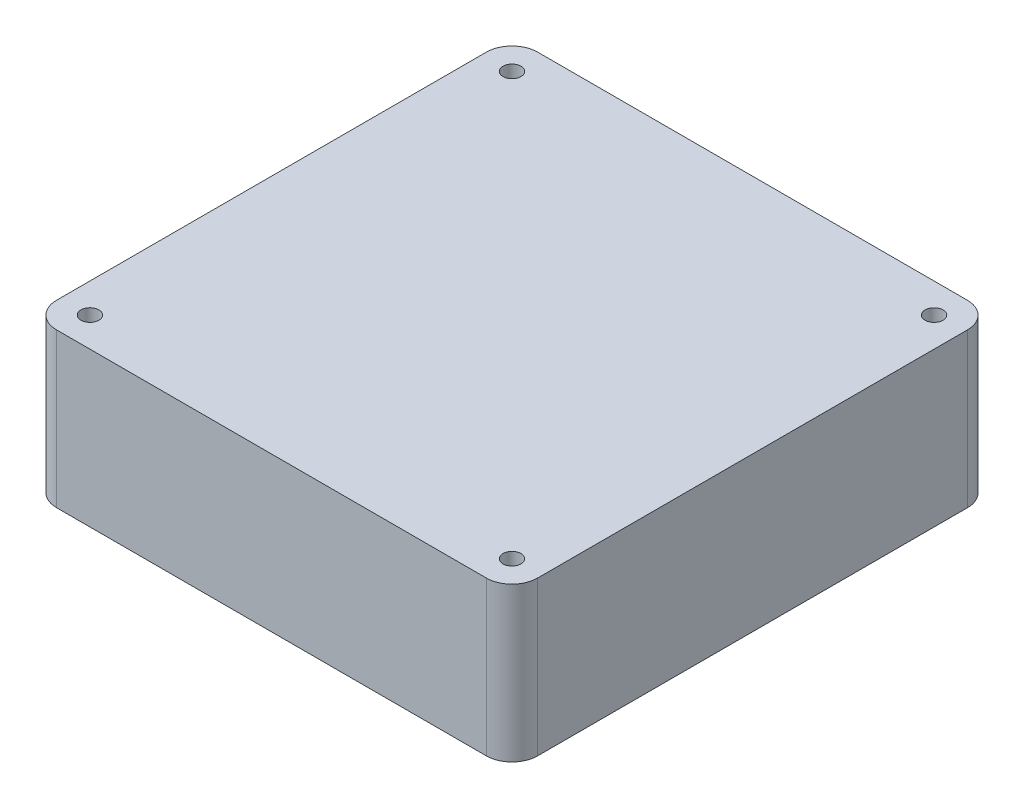
ISO-10303-21;
HEADER;
FILE_DESCRIPTION(('STEP AP214'),'2;1');
FILE_NAME('part.step','',(''),(''),'','','');
FILE_SCHEMA(('AUTOMOTIVE_DESIGN { 1 0 10303 214 1 1 1 1 }'));
ENDSEC;
DATA;
#1=APPLICATION_CONTEXT('core data for automotive mechanical design processes');
#2=APPLICATION_PROTOCOL_DEFINITION('international standard','automotive_design',2000,#1);
#3=PRODUCT_CONTEXT('',#1,'mechanical');
#4=PRODUCT('Part','Part','',(#3));
#5=PRODUCT_RELATED_PRODUCT_CATEGORY('part','',(#4));
#6=PRODUCT_DEFINITION_FORMATION('','',#4);
#7=PRODUCT_DEFINITION_CONTEXT('part definition',#1,'design');
#8=PRODUCT_DEFINITION('design','',#6,#7);
#9=PRODUCT_DEFINITION_SHAPE('','',#8);
#10=(LENGTH_UNIT() NAMED_UNIT(*) SI_UNIT(.MILLI.,.METRE.));
#11=(NAMED_UNIT(*) PLANE_ANGLE_UNIT() SI_UNIT($,.RADIAN.));
#12=(NAMED_UNIT(*) SI_UNIT($,.STERADIAN.) SOLID_ANGLE_UNIT());
#13=UNCERTAINTY_MEASURE_WITH_UNIT(LENGTH_MEASURE(1.E-05),#10,'distance_accuracy_value','');
#14=(GEOMETRIC_REPRESENTATION_CONTEXT(3) GLOBAL_UNCERTAINTY_ASSIGNED_CONTEXT((#13)) GLOBAL_UNIT_ASSIGNED_CONTEXT((#10,
#11,#12)) REPRESENTATION_CONTEXT('',''));
#15=CARTESIAN_POINT('',(0.,0.,0.));
#16=DIRECTION('',(0.,0.,1.));
#17=DIRECTION('',(1.,0.,0.));
#18=AXIS2_PLACEMENT_3D('',#15,#16,#17);
#19=CARTESIAN_POINT('',(-53.152675752502,38.1,53.1463240577313));
#20=DIRECTION('',(0.,-1.,0.));
#21=DIRECTION('',(0.,0.,-1.));
#22=AXIS2_PLACEMENT_3D('',#19,#20,#21);
#23=PLANE('',#22);
#24=CARTESIAN_POINT('',(52.1938809742594,38.1,52.2001188393747));
#25=DIRECTION('',(0.,1.,0.));
#26=DIRECTION('',(0.,0.,1.));
#27=AXIS2_PLACEMENT_3D('',#24,#25,#26);
#28=CIRCLE('',#27,2.2225);
#29=CARTESIAN_POINT('',(52.1938809742594,38.1,49.9776188393747));
#30=VERTEX_POINT('',#29);
#31=EDGE_CURVE('E188',#30,#30,#28,.T.);
#32=ORIENTED_EDGE('',*,*,#31,.F.);
#33=EDGE_LOOP('',(#32));
#34=FACE_BOUND('',#33,.T.);
#35=CARTESIAN_POINT('',(-52.1938809742594,38.1,-52.2001188393747));
#36=DIRECTION('',(0.,1.,0.));
#37=DIRECTION('',(0.,0.,1.));
#38=AXIS2_PLACEMENT_3D('',#35,#36,#37);
#39=CIRCLE('',#38,2.2225);
#40=CARTESIAN_POINT('',(-52.1938809742594,38.1,-54.4226188393747));
#41=VERTEX_POINT('',#40);
#42=EDGE_CURVE('E134',#41,#41,#39,.T.);
#43=ORIENTED_EDGE('',*,*,#42,.F.);
#44=EDGE_LOOP('',(#43));
#45=FACE_BOUND('',#44,.T.);
#46=CARTESIAN_POINT('',(-53.152675752502,38.1,53.1463240577313));
#47=DIRECTION('',(0.,1.,0.));
#48=DIRECTION('',(0.,0.,-1.));
#49=AXIS2_PLACEMENT_3D('',#46,#47,#48);
#50=CIRCLE('',#49,6.35);
#51=CARTESIAN_POINT('',(-59.5026757411659,38.1,53.1459446255466));
#52=VERTEX_POINT('',#51);
#53=CARTESIAN_POINT('',(-53.1530551846866,38.1,59.4963240463952));
#54=VERTEX_POINT('',#53);
#55=EDGE_CURVE('E145',#52,#54,#50,.T.);
#56=ORIENTED_EDGE('',*,*,#55,.T.);
#57=DIRECTION('',(0.999999998214784,0.,5.97530999416178E-05));
#58=VECTOR('',#57,1.);
#59=CARTESIAN_POINT('',(53.1459446255466,38.1,59.5026757411659));
#60=LINE('',#59,#58);
#61=CARTESIAN_POINT('',(53.1459446255466,38.1,59.5026757411659));
#62=VERTEX_POINT('',#61);
#63=EDGE_CURVE('E93',#54,#62,#60,.T.);
#64=ORIENTED_EDGE('',*,*,#63,.T.);
#65=CARTESIAN_POINT('',(53.1463240577313,38.1,53.152675752502));
#66=DIRECTION('',(0.,1.,0.));
#67=DIRECTION('',(0.,0.,1.));
#68=AXIS2_PLACEMENT_3D('',#65,#66,#67);
#69=CIRCLE('',#68,6.35);
#70=CARTESIAN_POINT('',(59.4963240463952,38.1,53.1530551846866));
#71=VERTEX_POINT('',#70);
#72=EDGE_CURVE('E160',#62,#71,#69,.T.);
#73=ORIENTED_EDGE('',*,*,#72,.T.);
#74=DIRECTION('',(5.97530999418136E-05,0.,-0.999999998214784));
#75=VECTOR('',#74,1.);
#76=CARTESIAN_POINT('',(59.4963240463952,38.1,53.1530551846866));
#77=LINE('',#76,#75);
#78=CARTESIAN_POINT('',(59.5026757411659,38.1,-53.1459446255466));
#79=VERTEX_POINT('',#78);
#80=EDGE_CURVE('E173',#71,#79,#77,.T.);
#81=ORIENTED_EDGE('',*,*,#80,.T.);
#82=CARTESIAN_POINT('',(53.152675752502,38.1,-53.1463240577313));
#83=DIRECTION('',(0.,1.,0.));
#84=DIRECTION('',(0.,0.,1.));
#85=AXIS2_PLACEMENT_3D('',#82,#83,#84);
#86=CIRCLE('',#85,6.35);
#87=CARTESIAN_POINT('',(53.1530551846866,38.1,-59.4963240463952));
#88=VERTEX_POINT('',#87);
#89=EDGE_CURVE('E112',#79,#88,#86,.T.);
#90=ORIENTED_EDGE('',*,*,#89,.T.);
#91=DIRECTION('',(-0.999999998214784,0.,-5.97530999416178E-05));
#92=VECTOR('',#91,1.);
#93=CARTESIAN_POINT('',(53.1530551846866,38.1,-59.4963240463952));
#94=LINE('',#93,#92);
#95=CARTESIAN_POINT('',(-53.1459446255466,38.1,-59.5026757411659));
#96=VERTEX_POINT('',#95);
#97=EDGE_CURVE('E106',#88,#96,#94,.T.);
#98=ORIENTED_EDGE('',*,*,#97,.T.);
#99=CARTESIAN_POINT('',(-53.1463240577313,38.1,-53.152675752502));
#100=DIRECTION('',(0.,1.,0.));
#101=DIRECTION('',(0.,0.,1.));
#102=AXIS2_PLACEMENT_3D('',#99,#100,#101);
#103=CIRCLE('',#102,6.35);
#104=CARTESIAN_POINT('',(-59.4963240463951,38.1,-53.1530551846866));
#105=VERTEX_POINT('',#104);
#106=EDGE_CURVE('E110',#96,#105,#103,.T.);
#107=ORIENTED_EDGE('',*,*,#106,.T.);
#108=DIRECTION('',(-5.97530999418136E-05,0.,0.999999998214784));
#109=VECTOR('',#108,1.);
#110=CARTESIAN_POINT('',(-59.5026757411659,38.1,53.1459446255466));
#111=LINE('',#110,#109);
#112=EDGE_CURVE('E50',#105,#52,#111,.T.);
#113=ORIENTED_EDGE('',*,*,#112,.T.);
#114=EDGE_LOOP('',(#56,#64,#73,#81,#90,#98,#107,#113));
#115=FACE_BOUND('',#114,.T.);
#116=CARTESIAN_POINT('',(52.2001188393747,38.1,-52.1938809742594));
#117=DIRECTION('',(0.,1.,0.));
#118=DIRECTION('',(0.,0.,1.));
#119=AXIS2_PLACEMENT_3D('',#116,#117,#118);
#120=CIRCLE('',#119,2.2225);
#121=CARTESIAN_POINT('',(52.2001188393747,38.1,-54.4163809742594));
#122=VERTEX_POINT('',#121);
#123=EDGE_CURVE('E182',#122,#122,#120,.T.);
#124=ORIENTED_EDGE('',*,*,#123,.F.);
#125=EDGE_LOOP('',(#124));
#126=FACE_BOUND('',#125,.T.);
#127=CARTESIAN_POINT('',(-52.2001188393747,38.1,52.1938809742594));
#128=DIRECTION('',(0.,1.,0.));
#129=DIRECTION('',(0.,0.,1.));
#130=AXIS2_PLACEMENT_3D('',#127,#128,#129);
#131=CIRCLE('',#130,2.2225);
#132=CARTESIAN_POINT('',(-52.2001188393747,38.1,49.9713809742594));
#133=VERTEX_POINT('',#132);
#134=EDGE_CURVE('E194',#133,#133,#131,.T.);
#135=ORIENTED_EDGE('',*,*,#134,.F.);
#136=EDGE_LOOP('',(#135));
#137=FACE_BOUND('',#136,.T.);
#138=ADVANCED_FACE('F33',(#34,#45,#115,#126,#137),#23,.F.);
#139=CARTESIAN_POINT('',(-53.152675752502,0.,53.1463240577313));
#140=DIRECTION('',(0.,-1.,0.));
#141=DIRECTION('',(0.,0.,-1.));
#142=AXIS2_PLACEMENT_3D('',#139,#140,#141);
#143=PLANE('',#142);
#144=CARTESIAN_POINT('',(52.1938809742594,0.,52.2001188393747));
#145=DIRECTION('',(0.,1.,0.));
#146=DIRECTION('',(0.,0.,1.));
#147=AXIS2_PLACEMENT_3D('',#144,#145,#146);
#148=CIRCLE('',#147,2.2225);
#149=CARTESIAN_POINT('',(52.1938809742594,0.,49.9776188393747));
#150=VERTEX_POINT('',#149);
#151=EDGE_CURVE('E191',#150,#150,#148,.T.);
#152=ORIENTED_EDGE('',*,*,#151,.T.);
#153=EDGE_LOOP('',(#152));
#154=FACE_BOUND('',#153,.T.);
#155=CARTESIAN_POINT('',(-52.1938809742594,0.,-52.2001188393747));
#156=DIRECTION('',(0.,1.,0.));
#157=DIRECTION('',(0.,0.,1.));
#158=AXIS2_PLACEMENT_3D('',#155,#156,#157);
#159=CIRCLE('',#158,2.2225);
#160=CARTESIAN_POINT('',(-52.1938809742594,0.,-54.4226188393747));
#161=VERTEX_POINT('',#160);
#162=EDGE_CURVE('E179',#161,#161,#159,.T.);
#163=ORIENTED_EDGE('',*,*,#162,.T.);
#164=EDGE_LOOP('',(#163));
#165=FACE_BOUND('',#164,.T.);
#166=CARTESIAN_POINT('',(-53.152675752502,0.,53.1463240577313));
#167=DIRECTION('',(0.,1.,0.));
#168=DIRECTION('',(0.,0.,-1.));
#169=AXIS2_PLACEMENT_3D('',#166,#167,#168);
#170=CIRCLE('',#169,6.35);
#171=CARTESIAN_POINT('',(-59.5026757411659,0.,53.1459446255466));
#172=VERTEX_POINT('',#171);
#173=CARTESIAN_POINT('',(-53.1530551846866,0.,59.4963240463952));
#174=VERTEX_POINT('',#173);
#175=EDGE_CURVE('E130',#172,#174,#170,.T.);
#176=ORIENTED_EDGE('',*,*,#175,.F.);
#177=DIRECTION('',(-5.97530999418136E-05,0.,0.999999998214784));
#178=VECTOR('',#177,1.);
#179=CARTESIAN_POINT('',(-59.5026757411659,0.,53.1459446255466));
#180=LINE('',#179,#178);
#181=CARTESIAN_POINT('',(-59.4963240463951,0.,-53.1530551846866));
#182=VERTEX_POINT('',#181);
#183=EDGE_CURVE('E85',#182,#172,#180,.T.);
#184=ORIENTED_EDGE('',*,*,#183,.F.);
#185=CARTESIAN_POINT('',(-53.1463240577313,0.,-53.152675752502));
#186=DIRECTION('',(0.,1.,0.));
#187=DIRECTION('',(0.,0.,1.));
#188=AXIS2_PLACEMENT_3D('',#185,#186,#187);
#189=CIRCLE('',#188,6.35);
#190=CARTESIAN_POINT('',(-53.1459446255466,0.,-59.5026757411659));
#191=VERTEX_POINT('',#190);
#192=EDGE_CURVE('E79',#191,#182,#189,.T.);
#193=ORIENTED_EDGE('',*,*,#192,.F.);
#194=DIRECTION('',(-0.999999998214784,0.,-5.97530999416178E-05));
#195=VECTOR('',#194,1.);
#196=CARTESIAN_POINT('',(53.1530551846866,0.,-59.4963240463952));
#197=LINE('',#196,#195);
#198=CARTESIAN_POINT('',(53.1530551846866,0.,-59.4963240463952));
#199=VERTEX_POINT('',#198);
#200=EDGE_CURVE('E120',#199,#191,#197,.T.);
#201=ORIENTED_EDGE('',*,*,#200,.F.);
#202=CARTESIAN_POINT('',(53.152675752502,0.,-53.1463240577313));
#203=DIRECTION('',(0.,1.,0.));
#204=DIRECTION('',(0.,0.,1.));
#205=AXIS2_PLACEMENT_3D('',#202,#203,#204);
#206=CIRCLE('',#205,6.35);
#207=CARTESIAN_POINT('',(59.5026757411659,0.,-53.1459446255466));
#208=VERTEX_POINT('',#207);
#209=EDGE_CURVE('E140',#208,#199,#206,.T.);
#210=ORIENTED_EDGE('',*,*,#209,.F.);
#211=DIRECTION('',(5.97530999418136E-05,0.,-0.999999998214784));
#212=VECTOR('',#211,1.);
#213=CARTESIAN_POINT('',(59.4963240463952,0.,53.1530551846866));
#214=LINE('',#213,#212);
#215=CARTESIAN_POINT('',(59.4963240463952,0.,53.1530551846866));
#216=VERTEX_POINT('',#215);
#217=EDGE_CURVE('E138',#216,#208,#214,.T.);
#218=ORIENTED_EDGE('',*,*,#217,.F.);
#219=CARTESIAN_POINT('',(53.1463240577313,0.,53.152675752502));
#220=DIRECTION('',(0.,1.,0.));
#221=DIRECTION('',(0.,0.,1.));
#222=AXIS2_PLACEMENT_3D('',#219,#220,#221);
#223=CIRCLE('',#222,6.35);
#224=CARTESIAN_POINT('',(53.1459446255466,0.,59.5026757411659));
#225=VERTEX_POINT('',#224);
#226=EDGE_CURVE('E136',#225,#216,#223,.T.);
#227=ORIENTED_EDGE('',*,*,#226,.F.);
#228=DIRECTION('',(0.999999998214784,0.,5.97530999416178E-05));
#229=VECTOR('',#228,1.);
#230=CARTESIAN_POINT('',(53.1459446255466,0.,59.5026757411659));
#231=LINE('',#230,#229);
#232=EDGE_CURVE('E133',#174,#225,#231,.T.);
#233=ORIENTED_EDGE('',*,*,#232,.F.);
#234=EDGE_LOOP('',(#176,#184,#193,#201,#210,#218,#227,#233));
#235=FACE_BOUND('',#234,.T.);
#236=CARTESIAN_POINT('',(52.2001188393747,0.,-52.1938809742594));
#237=DIRECTION('',(0.,1.,0.));
#238=DIRECTION('',(0.,0.,1.));
#239=AXIS2_PLACEMENT_3D('',#236,#237,#238);
#240=CIRCLE('',#239,2.2225);
#241=CARTESIAN_POINT('',(52.2001188393747,0.,-54.4163809742594));
#242=VERTEX_POINT('',#241);
#243=EDGE_CURVE('E185',#242,#242,#240,.T.);
#244=ORIENTED_EDGE('',*,*,#243,.T.);
#245=EDGE_LOOP('',(#244));
#246=FACE_BOUND('',#245,.T.);
#247=CARTESIAN_POINT('',(-52.2001188393747,0.,52.1938809742594));
#248=DIRECTION('',(0.,1.,0.));
#249=DIRECTION('',(0.,0.,1.));
#250=AXIS2_PLACEMENT_3D('',#247,#248,#249);
#251=CIRCLE('',#250,2.2225);
#252=CARTESIAN_POINT('',(-52.2001188393747,0.,49.9713809742594));
#253=VERTEX_POINT('',#252);
#254=EDGE_CURVE('E197',#253,#253,#251,.T.);
#255=ORIENTED_EDGE('',*,*,#254,.T.);
#256=EDGE_LOOP('',(#255));
#257=FACE_BOUND('',#256,.T.);
#258=ADVANCED_FACE('F164',(#154,#165,#235,#246,#257),#143,.T.);
#259=CARTESIAN_POINT('',(-53.152675752502,38.1,53.1463240577313));
#260=DIRECTION('',(0.,-1.,0.));
#261=DIRECTION('',(0.,0.,-1.));
#262=AXIS2_PLACEMENT_3D('',#259,#260,#261);
#263=CYLINDRICAL_SURFACE('',#262,6.35);
#264=ORIENTED_EDGE('',*,*,#175,.T.);
#265=DIRECTION('',(0.,-1.,0.));
#266=VECTOR('',#265,1.);
#267=CARTESIAN_POINT('',(-53.1530551846866,38.1,59.4963240463952));
#268=LINE('',#267,#266);
#269=EDGE_CURVE('E11',#54,#174,#268,.T.);
#270=ORIENTED_EDGE('',*,*,#269,.F.);
#271=ORIENTED_EDGE('',*,*,#55,.F.);
#272=DIRECTION('',(0.,-1.,0.));
#273=VECTOR('',#272,1.);
#274=CARTESIAN_POINT('',(-59.5026757411659,38.1,53.1459446255466));
#275=LINE('',#274,#273);
#276=EDGE_CURVE('E126',#52,#172,#275,.T.);
#277=ORIENTED_EDGE('',*,*,#276,.T.);
#278=EDGE_LOOP('',(#264,#270,#271,#277));
#279=FACE_BOUND('',#278,.T.);
#280=ADVANCED_FACE('F35',(#279),#263,.T.);
#281=CARTESIAN_POINT('',(53.1459446255466,38.1,59.5026757411659));
#282=DIRECTION('',(5.97530999416178E-05,0.,-0.999999998214783));
#283=DIRECTION('',(-0.999999998214784,0.,-5.97530999416178E-05));
#284=AXIS2_PLACEMENT_3D('',#281,#282,#283);
#285=PLANE('',#284);
#286=ORIENTED_EDGE('',*,*,#232,.T.);
#287=DIRECTION('',(0.,-1.,0.));
#288=VECTOR('',#287,1.);
#289=CARTESIAN_POINT('',(53.1459446255466,38.1,59.5026757411659));
#290=LINE('',#289,#288);
#291=EDGE_CURVE('E42',#62,#225,#290,.T.);
#292=ORIENTED_EDGE('',*,*,#291,.F.);
#293=ORIENTED_EDGE('',*,*,#63,.F.);
#294=ORIENTED_EDGE('',*,*,#269,.T.);
#295=EDGE_LOOP('',(#286,#292,#293,#294));
#296=FACE_BOUND('',#295,.T.);
#297=ADVANCED_FACE('F232',(#296),#285,.F.);
#298=CARTESIAN_POINT('',(53.1463240577313,38.1,53.152675752502));
#299=DIRECTION('',(0.,-1.,0.));
#300=DIRECTION('',(0.,0.,-1.));
#301=AXIS2_PLACEMENT_3D('',#298,#299,#300);
#302=CYLINDRICAL_SURFACE('',#301,6.35);
#303=ORIENTED_EDGE('',*,*,#226,.T.);
#304=DIRECTION('',(0.,-1.,0.));
#305=VECTOR('',#304,1.);
#306=CARTESIAN_POINT('',(59.4963240463952,38.1,53.1530551846866));
#307=LINE('',#306,#305);
#308=EDGE_CURVE('E152',#71,#216,#307,.T.);
#309=ORIENTED_EDGE('',*,*,#308,.F.);
#310=ORIENTED_EDGE('',*,*,#72,.F.);
#311=ORIENTED_EDGE('',*,*,#291,.T.);
#312=EDGE_LOOP('',(#303,#309,#310,#311));
#313=FACE_BOUND('',#312,.T.);
#314=ADVANCED_FACE('F158',(#313),#302,.T.);
#315=CARTESIAN_POINT('',(59.4963240463952,38.1,53.1530551846866));
#316=DIRECTION('',(-0.999999998214783,0.,-5.97530999418136E-05));
#317=DIRECTION('',(-5.97530999418136E-05,0.,0.999999998214784));
#318=AXIS2_PLACEMENT_3D('',#315,#316,#317);
#319=PLANE('',#318);
#320=ORIENTED_EDGE('',*,*,#217,.T.);
#321=DIRECTION('',(0.,-1.,0.));
#322=VECTOR('',#321,1.);
#323=CARTESIAN_POINT('',(59.5026757411659,38.1,-53.1459446255466));
#324=LINE('',#323,#322);
#325=EDGE_CURVE('E149',#79,#208,#324,.T.);
#326=ORIENTED_EDGE('',*,*,#325,.F.);
#327=ORIENTED_EDGE('',*,*,#80,.F.);
#328=ORIENTED_EDGE('',*,*,#308,.T.);
#329=EDGE_LOOP('',(#320,#326,#327,#328));
#330=FACE_BOUND('',#329,.T.);
#331=ADVANCED_FACE('F169',(#330),#319,.F.);
#332=CARTESIAN_POINT('',(53.152675752502,38.1,-53.1463240577313));
#333=DIRECTION('',(0.,-1.,0.));
#334=DIRECTION('',(0.,0.,-1.));
#335=AXIS2_PLACEMENT_3D('',#332,#333,#334);
#336=CYLINDRICAL_SURFACE('',#335,6.35);
#337=ORIENTED_EDGE('',*,*,#209,.T.);
#338=DIRECTION('',(0.,-1.,0.));
#339=VECTOR('',#338,1.);
#340=CARTESIAN_POINT('',(53.1530551846866,38.1,-59.4963240463952));
#341=LINE('',#340,#339);
#342=EDGE_CURVE('E121',#88,#199,#341,.T.);
#343=ORIENTED_EDGE('',*,*,#342,.F.);
#344=ORIENTED_EDGE('',*,*,#89,.F.);
#345=ORIENTED_EDGE('',*,*,#325,.T.);
#346=EDGE_LOOP('',(#337,#343,#344,#345));
#347=FACE_BOUND('',#346,.T.);
#348=ADVANCED_FACE('F172',(#347),#336,.T.);
#349=CARTESIAN_POINT('',(53.1530551846866,38.1,-59.4963240463952));
#350=DIRECTION('',(-5.97530999416178E-05,0.,0.999999998214783));
#351=DIRECTION('',(0.999999998214784,0.,5.97530999416178E-05));
#352=AXIS2_PLACEMENT_3D('',#349,#350,#351);
#353=PLANE('',#352);
#354=ORIENTED_EDGE('',*,*,#200,.T.);
#355=DIRECTION('',(0.,-1.,0.));
#356=VECTOR('',#355,1.);
#357=CARTESIAN_POINT('',(-53.1459446255466,38.1,-59.5026757411659));
#358=LINE('',#357,#356);
#359=EDGE_CURVE('E117',#96,#191,#358,.T.);
#360=ORIENTED_EDGE('',*,*,#359,.F.);
#361=ORIENTED_EDGE('',*,*,#97,.F.);
#362=ORIENTED_EDGE('',*,*,#342,.T.);
#363=EDGE_LOOP('',(#354,#360,#361,#362));
#364=FACE_BOUND('',#363,.T.);
#365=ADVANCED_FACE('F118',(#364),#353,.F.);
#366=CARTESIAN_POINT('',(-53.1463240577313,38.1,-53.152675752502));
#367=DIRECTION('',(0.,-1.,0.));
#368=DIRECTION('',(0.,0.,-1.));
#369=AXIS2_PLACEMENT_3D('',#366,#367,#368);
#370=CYLINDRICAL_SURFACE('',#369,6.35);
#371=ORIENTED_EDGE('',*,*,#192,.T.);
#372=DIRECTION('',(0.,-1.,0.));
#373=VECTOR('',#372,1.);
#374=CARTESIAN_POINT('',(-59.4963240463951,38.1,-53.1530551846866));
#375=LINE('',#374,#373);
#376=EDGE_CURVE('E122',#105,#182,#375,.T.);
#377=ORIENTED_EDGE('',*,*,#376,.F.);
#378=ORIENTED_EDGE('',*,*,#106,.F.);
#379=ORIENTED_EDGE('',*,*,#359,.T.);
#380=EDGE_LOOP('',(#371,#377,#378,#379));
#381=FACE_BOUND('',#380,.T.);
#382=ADVANCED_FACE('F124',(#381),#370,.T.);
#383=CARTESIAN_POINT('',(-59.5026757411659,38.1,53.1459446255466));
#384=DIRECTION('',(0.999999998214783,0.,5.97530999418136E-05));
#385=DIRECTION('',(5.97530999418136E-05,0.,-0.999999998214784));
#386=AXIS2_PLACEMENT_3D('',#383,#384,#385);
#387=PLANE('',#386);
#388=ORIENTED_EDGE('',*,*,#183,.T.);
#389=ORIENTED_EDGE('',*,*,#276,.F.);
#390=ORIENTED_EDGE('',*,*,#112,.F.);
#391=ORIENTED_EDGE('',*,*,#376,.T.);
#392=EDGE_LOOP('',(#388,#389,#390,#391));
#393=FACE_BOUND('',#392,.T.);
#394=ADVANCED_FACE('F220',(#393),#387,.F.);
#395=CARTESIAN_POINT('',(-52.1938809742594,38.1,-52.2001188393747));
#396=DIRECTION('',(0.,-1.,0.));
#397=DIRECTION('',(0.,0.,-1.));
#398=AXIS2_PLACEMENT_3D('',#395,#396,#397);
#399=CYLINDRICAL_SURFACE('',#398,2.2225);
#400=CARTESIAN_POINT('',(-52.1938809742594,38.1,-54.4226188393747));
#401=CARTESIAN_POINT('',(-52.1938809742594,37.703125,-54.4226188393747));
#402=CARTESIAN_POINT('',(-52.1938809742594,37.30625,-54.4226188393747));
#403=CARTESIAN_POINT('',(-52.1938809742594,36.5125,-54.4226188393747));
#404=CARTESIAN_POINT('',(-52.1938809742594,36.115625,-54.4226188393747));
#405=CARTESIAN_POINT('',(-52.1938809742594,35.321875,-54.4226188393747));
#406=CARTESIAN_POINT('',(-52.1938809742594,34.925,-54.4226188393747));
#407=CARTESIAN_POINT('',(-52.1938809742594,34.13125,-54.4226188393747));
#408=CARTESIAN_POINT('',(-52.1938809742594,33.734375,-54.4226188393747));
#409=CARTESIAN_POINT('',(-52.1938809742594,32.940625,-54.4226188393747));
#410=CARTESIAN_POINT('',(-52.1938809742594,32.54375,-54.4226188393747));
#411=CARTESIAN_POINT('',(-52.1938809742594,31.75,-54.4226188393747));
#412=CARTESIAN_POINT('',(-52.1938809742594,31.353125,-54.4226188393747));
#413=CARTESIAN_POINT('',(-52.1938809742594,30.559375,-54.4226188393747));
#414=CARTESIAN_POINT('',(-52.1938809742594,30.1625,-54.4226188393747));
#415=CARTESIAN_POINT('',(-52.1938809742594,29.36875,-54.4226188393747));
#416=CARTESIAN_POINT('',(-52.1938809742594,28.971875,-54.4226188393747));
#417=CARTESIAN_POINT('',(-52.1938809742594,28.178125,-54.4226188393747));
#418=CARTESIAN_POINT('',(-52.1938809742594,27.78125,-54.4226188393747));
#419=CARTESIAN_POINT('',(-52.1938809742594,26.9875,-54.4226188393747));
#420=CARTESIAN_POINT('',(-52.1938809742594,26.590625,-54.4226188393747));
#421=CARTESIAN_POINT('',(-52.1938809742594,25.796875,-54.4226188393747));
#422=CARTESIAN_POINT('',(-52.1938809742594,25.4,-54.4226188393747));
#423=CARTESIAN_POINT('',(-52.1938809742594,24.60625,-54.4226188393747));
#424=CARTESIAN_POINT('',(-52.1938809742594,24.209375,-54.4226188393747));
#425=CARTESIAN_POINT('',(-52.1938809742594,23.415625,-54.4226188393747));
#426=CARTESIAN_POINT('',(-52.1938809742594,23.01875,-54.4226188393747));
#427=CARTESIAN_POINT('',(-52.1938809742594,22.225,-54.4226188393747));
#428=CARTESIAN_POINT('',(-52.1938809742594,21.828125,-54.4226188393747));
#429=CARTESIAN_POINT('',(-52.1938809742594,21.034375,-54.4226188393747));
#430=CARTESIAN_POINT('',(-52.1938809742594,20.6375,-54.4226188393747));
#431=CARTESIAN_POINT('',(-52.1938809742594,19.84375,-54.4226188393747));
#432=CARTESIAN_POINT('',(-52.1938809742594,19.446875,-54.4226188393747));
#433=CARTESIAN_POINT('',(-52.1938809742594,18.653125,-54.4226188393747));
#434=CARTESIAN_POINT('',(-52.1938809742594,18.25625,-54.4226188393747));
#435=CARTESIAN_POINT('',(-52.1938809742594,17.4625,-54.4226188393747));
#436=CARTESIAN_POINT('',(-52.1938809742594,17.065625,-54.4226188393747));
#437=CARTESIAN_POINT('',(-52.1938809742594,16.271875,-54.4226188393747));
#438=CARTESIAN_POINT('',(-52.1938809742594,15.875,-54.4226188393747));
#439=CARTESIAN_POINT('',(-52.1938809742594,15.08125,-54.4226188393747));
#440=CARTESIAN_POINT('',(-52.1938809742594,14.684375,-54.4226188393747));
#441=CARTESIAN_POINT('',(-52.1938809742594,13.890625,-54.4226188393747));
#442=CARTESIAN_POINT('',(-52.1938809742594,13.49375,-54.4226188393747));
#443=CARTESIAN_POINT('',(-52.1938809742594,12.7,-54.4226188393747));
#444=CARTESIAN_POINT('',(-52.1938809742594,12.303125,-54.4226188393747));
#445=CARTESIAN_POINT('',(-52.1938809742594,11.509375,-54.4226188393747));
#446=CARTESIAN_POINT('',(-52.1938809742594,11.1125,-54.4226188393747));
#447=CARTESIAN_POINT('',(-52.1938809742594,10.31875,-54.4226188393747));
#448=CARTESIAN_POINT('',(-52.1938809742594,9.92187499999999,-54.4226188393747));
#449=CARTESIAN_POINT('',(-52.1938809742594,9.128125,-54.4226188393747));
#450=CARTESIAN_POINT('',(-52.1938809742594,8.73124999999999,-54.4226188393747));
#451=CARTESIAN_POINT('',(-52.1938809742594,7.93749999999999,-54.4226188393747));
#452=CARTESIAN_POINT('',(-52.1938809742594,7.54062499999999,-54.4226188393747));
#453=CARTESIAN_POINT('',(-52.1938809742594,6.746875,-54.4226188393747));
#454=CARTESIAN_POINT('',(-52.1938809742594,6.35,-54.4226188393747));
#455=CARTESIAN_POINT('',(-52.1938809742594,5.55625,-54.4226188393747));
#456=CARTESIAN_POINT('',(-52.1938809742594,5.159375,-54.4226188393747));
#457=CARTESIAN_POINT('',(-52.1938809742594,4.365625,-54.4226188393747));
#458=CARTESIAN_POINT('',(-52.1938809742594,3.96875,-54.4226188393747));
#459=CARTESIAN_POINT('',(-52.1938809742594,3.175,-54.4226188393747));
#460=CARTESIAN_POINT('',(-52.1938809742594,2.778125,-54.4226188393747));
#461=CARTESIAN_POINT('',(-52.1938809742594,1.984375,-54.4226188393747));
#462=CARTESIAN_POINT('',(-52.1938809742594,1.5875,-54.4226188393747));
#463=CARTESIAN_POINT('',(-52.1938809742594,0.79375,-54.4226188393747));
#464=CARTESIAN_POINT('',(-52.1938809742594,0.396875,-54.4226188393747));
#465=CARTESIAN_POINT('',(-52.1938809742594,0.,-54.4226188393747));
#466=B_SPLINE_CURVE_WITH_KNOTS('',3,(#400,#401,#402,#403,#404,#405,#406,#407,#408,#409,#410,
#411,#412,#413,#414,#415,#416,#417,#418,#419,#420,#421,#422,#423,#424,#425,#426,#427,#428,#429,
#430,#431,#432,#433,#434,#435,#436,#437,#438,#439,#440,#441,#442,#443,#444,#445,#446,#447,#448,
#449,#450,#451,#452,#453,#454,#455,#456,#457,#458,#459,#460,#461,#462,#463,#464,#465),
.UNSPECIFIED.,.F.,.F.,(4,2,2,2,2,2,2,2,2,2,2,2,2,2,2,2,2,2,2,2,2,2,2,2,2,2,2,2,2,2,2,2,4),(0.,
1.190625,2.38125,3.571875,4.7625,5.953125,7.14375,8.334375,9.52500000000001,10.715625,11.90625,
13.096875,14.2875,15.478125,16.66875,17.859375,19.05,20.240625,21.43125,22.621875,23.8125,
25.003125,26.19375,27.384375,28.575,29.765625,30.95625,32.146875,33.3375,34.528125,35.71875,
36.909375,38.1),.UNSPECIFIED.);
#467=EDGE_CURVE('BSEAM217',#41,#161,#466,.T.);
#468=ORIENTED_EDGE('',*,*,#42,.T.);
#469=ORIENTED_EDGE('',*,*,#162,.F.);
#470=ORIENTED_EDGE('',*,*,#467,.T.);
#471=ORIENTED_EDGE('',*,*,#467,.F.);
#472=EDGE_LOOP('',(#468,#470,#469,#471));
#473=FACE_BOUND('',#472,.T.);
#474=ADVANCED_FACE('F217',(#473),#399,.F.);
#475=CARTESIAN_POINT('',(52.2001188393747,38.1,-52.1938809742594));
#476=DIRECTION('',(0.,-1.,0.));
#477=DIRECTION('',(0.,0.,-1.));
#478=AXIS2_PLACEMENT_3D('',#475,#476,#477);
#479=CYLINDRICAL_SURFACE('',#478,2.2225);
#480=CARTESIAN_POINT('',(52.2001188393747,38.1,-54.4163809742594));
#481=CARTESIAN_POINT('',(52.2001188393747,37.703125,-54.4163809742594));
#482=CARTESIAN_POINT('',(52.2001188393747,37.30625,-54.4163809742594));
#483=CARTESIAN_POINT('',(52.2001188393747,36.5125,-54.4163809742594));
#484=CARTESIAN_POINT('',(52.2001188393747,36.115625,-54.4163809742594));
#485=CARTESIAN_POINT('',(52.2001188393747,35.321875,-54.4163809742594));
#486=CARTESIAN_POINT('',(52.2001188393747,34.925,-54.4163809742594));
#487=CARTESIAN_POINT('',(52.2001188393747,34.13125,-54.4163809742594));
#488=CARTESIAN_POINT('',(52.2001188393747,33.734375,-54.4163809742594));
#489=CARTESIAN_POINT('',(52.2001188393747,32.940625,-54.4163809742594));
#490=CARTESIAN_POINT('',(52.2001188393747,32.54375,-54.4163809742594));
#491=CARTESIAN_POINT('',(52.2001188393747,31.75,-54.4163809742594));
#492=CARTESIAN_POINT('',(52.2001188393747,31.353125,-54.4163809742594));
#493=CARTESIAN_POINT('',(52.2001188393747,30.559375,-54.4163809742594));
#494=CARTESIAN_POINT('',(52.2001188393747,30.1625,-54.4163809742594));
#495=CARTESIAN_POINT('',(52.2001188393747,29.36875,-54.4163809742594));
#496=CARTESIAN_POINT('',(52.2001188393747,28.971875,-54.4163809742594));
#497=CARTESIAN_POINT('',(52.2001188393747,28.178125,-54.4163809742594));
#498=CARTESIAN_POINT('',(52.2001188393747,27.78125,-54.4163809742594));
#499=CARTESIAN_POINT('',(52.2001188393747,26.9875,-54.4163809742594));
#500=CARTESIAN_POINT('',(52.2001188393747,26.590625,-54.4163809742594));
#501=CARTESIAN_POINT('',(52.2001188393747,25.796875,-54.4163809742594));
#502=CARTESIAN_POINT('',(52.2001188393747,25.4,-54.4163809742594));
#503=CARTESIAN_POINT('',(52.2001188393747,24.60625,-54.4163809742594));
#504=CARTESIAN_POINT('',(52.2001188393747,24.209375,-54.4163809742594));
#505=CARTESIAN_POINT('',(52.2001188393747,23.415625,-54.4163809742594));
#506=CARTESIAN_POINT('',(52.2001188393747,23.01875,-54.4163809742594));
#507=CARTESIAN_POINT('',(52.2001188393747,22.225,-54.4163809742594));
#508=CARTESIAN_POINT('',(52.2001188393747,21.828125,-54.4163809742594));
#509=CARTESIAN_POINT('',(52.2001188393747,21.034375,-54.4163809742594));
#510=CARTESIAN_POINT('',(52.2001188393747,20.6375,-54.4163809742594));
#511=CARTESIAN_POINT('',(52.2001188393747,19.84375,-54.4163809742594));
#512=CARTESIAN_POINT('',(52.2001188393747,19.446875,-54.4163809742594));
#513=CARTESIAN_POINT('',(52.2001188393747,18.653125,-54.4163809742594));
#514=CARTESIAN_POINT('',(52.2001188393747,18.25625,-54.4163809742594));
#515=CARTESIAN_POINT('',(52.2001188393747,17.4625,-54.4163809742594));
#516=CARTESIAN_POINT('',(52.2001188393747,17.065625,-54.4163809742594));
#517=CARTESIAN_POINT('',(52.2001188393747,16.271875,-54.4163809742594));
#518=CARTESIAN_POINT('',(52.2001188393747,15.875,-54.4163809742594));
#519=CARTESIAN_POINT('',(52.2001188393747,15.08125,-54.4163809742594));
#520=CARTESIAN_POINT('',(52.2001188393747,14.684375,-54.4163809742594));
#521=CARTESIAN_POINT('',(52.2001188393747,13.890625,-54.4163809742594));
#522=CARTESIAN_POINT('',(52.2001188393747,13.49375,-54.4163809742594));
#523=CARTESIAN_POINT('',(52.2001188393747,12.7,-54.4163809742594));
#524=CARTESIAN_POINT('',(52.2001188393747,12.303125,-54.4163809742594));
#525=CARTESIAN_POINT('',(52.2001188393747,11.509375,-54.4163809742594));
#526=CARTESIAN_POINT('',(52.2001188393747,11.1125,-54.4163809742594));
#527=CARTESIAN_POINT('',(52.2001188393747,10.31875,-54.4163809742594));
#528=CARTESIAN_POINT('',(52.2001188393747,9.92187499999999,-54.4163809742594));
#529=CARTESIAN_POINT('',(52.2001188393747,9.128125,-54.4163809742594));
#530=CARTESIAN_POINT('',(52.2001188393747,8.73124999999999,-54.4163809742594));
#531=CARTESIAN_POINT('',(52.2001188393747,7.93749999999999,-54.4163809742594));
#532=CARTESIAN_POINT('',(52.2001188393747,7.54062499999999,-54.4163809742594));
#533=CARTESIAN_POINT('',(52.2001188393747,6.746875,-54.4163809742594));
#534=CARTESIAN_POINT('',(52.2001188393747,6.35,-54.4163809742594));
#535=CARTESIAN_POINT('',(52.2001188393747,5.55625,-54.4163809742594));
#536=CARTESIAN_POINT('',(52.2001188393747,5.159375,-54.4163809742594));
#537=CARTESIAN_POINT('',(52.2001188393747,4.365625,-54.4163809742594));
#538=CARTESIAN_POINT('',(52.2001188393747,3.96875,-54.4163809742594));
#539=CARTESIAN_POINT('',(52.2001188393747,3.175,-54.4163809742594));
#540=CARTESIAN_POINT('',(52.2001188393747,2.778125,-54.4163809742594));
#541=CARTESIAN_POINT('',(52.2001188393747,1.984375,-54.4163809742594));
#542=CARTESIAN_POINT('',(52.2001188393747,1.5875,-54.4163809742594));
#543=CARTESIAN_POINT('',(52.2001188393747,0.79375,-54.4163809742594));
#544=CARTESIAN_POINT('',(52.2001188393747,0.396875,-54.4163809742594));
#545=CARTESIAN_POINT('',(52.2001188393747,0.,-54.4163809742594));
#546=B_SPLINE_CURVE_WITH_KNOTS('',3,(#480,#481,#482,#483,#484,#485,#486,#487,#488,#489,#490,
#491,#492,#493,#494,#495,#496,#497,#498,#499,#500,#501,#502,#503,#504,#505,#506,#507,#508,#509,
#510,#511,#512,#513,#514,#515,#516,#517,#518,#519,#520,#521,#522,#523,#524,#525,#526,#527,#528,
#529,#530,#531,#532,#533,#534,#535,#536,#537,#538,#539,#540,#541,#542,#543,#544,#545),
.UNSPECIFIED.,.F.,.F.,(4,2,2,2,2,2,2,2,2,2,2,2,2,2,2,2,2,2,2,2,2,2,2,2,2,2,2,2,2,2,2,2,4),(0.,
1.190625,2.38125,3.571875,4.7625,5.953125,7.14375,8.334375,9.52500000000001,10.715625,11.90625,
13.096875,14.2875,15.478125,16.66875,17.859375,19.05,20.240625,21.43125,22.621875,23.8125,
25.003125,26.19375,27.384375,28.575,29.765625,30.95625,32.146875,33.3375,34.528125,35.71875,
36.909375,38.1),.UNSPECIFIED.);
#547=EDGE_CURVE('BSEAM296',#122,#242,#546,.T.);
#548=ORIENTED_EDGE('',*,*,#123,.T.);
#549=ORIENTED_EDGE('',*,*,#243,.F.);
#550=ORIENTED_EDGE('',*,*,#547,.T.);
#551=ORIENTED_EDGE('',*,*,#547,.F.);
#552=EDGE_LOOP('',(#548,#550,#549,#551));
#553=FACE_BOUND('',#552,.T.);
#554=ADVANCED_FACE('F296',(#553),#479,.F.);
#555=CARTESIAN_POINT('',(52.1938809742594,38.1,52.2001188393747));
#556=DIRECTION('',(0.,-1.,0.));
#557=DIRECTION('',(0.,0.,-1.));
#558=AXIS2_PLACEMENT_3D('',#555,#556,#557);
#559=CYLINDRICAL_SURFACE('',#558,2.2225);
#560=CARTESIAN_POINT('',(52.1938809742594,38.1,49.9776188393747));
#561=CARTESIAN_POINT('',(52.1938809742594,37.703125,49.9776188393747));
#562=CARTESIAN_POINT('',(52.1938809742594,37.30625,49.9776188393747));
#563=CARTESIAN_POINT('',(52.1938809742594,36.5125,49.9776188393747));
#564=CARTESIAN_POINT('',(52.1938809742594,36.115625,49.9776188393747));
#565=CARTESIAN_POINT('',(52.1938809742594,35.321875,49.9776188393747));
#566=CARTESIAN_POINT('',(52.1938809742594,34.925,49.9776188393747));
#567=CARTESIAN_POINT('',(52.1938809742594,34.13125,49.9776188393747));
#568=CARTESIAN_POINT('',(52.1938809742594,33.734375,49.9776188393747));
#569=CARTESIAN_POINT('',(52.1938809742594,32.940625,49.9776188393747));
#570=CARTESIAN_POINT('',(52.1938809742594,32.54375,49.9776188393747));
#571=CARTESIAN_POINT('',(52.1938809742594,31.75,49.9776188393747));
#572=CARTESIAN_POINT('',(52.1938809742594,31.353125,49.9776188393747));
#573=CARTESIAN_POINT('',(52.1938809742594,30.559375,49.9776188393747));
#574=CARTESIAN_POINT('',(52.1938809742594,30.1625,49.9776188393747));
#575=CARTESIAN_POINT('',(52.1938809742594,29.36875,49.9776188393747));
#576=CARTESIAN_POINT('',(52.1938809742594,28.971875,49.9776188393747));
#577=CARTESIAN_POINT('',(52.1938809742594,28.178125,49.9776188393747));
#578=CARTESIAN_POINT('',(52.1938809742594,27.78125,49.9776188393747));
#579=CARTESIAN_POINT('',(52.1938809742594,26.9875,49.9776188393747));
#580=CARTESIAN_POINT('',(52.1938809742594,26.590625,49.9776188393747));
#581=CARTESIAN_POINT('',(52.1938809742594,25.796875,49.9776188393747));
#582=CARTESIAN_POINT('',(52.1938809742594,25.4,49.9776188393747));
#583=CARTESIAN_POINT('',(52.1938809742594,24.60625,49.9776188393747));
#584=CARTESIAN_POINT('',(52.1938809742594,24.209375,49.9776188393747));
#585=CARTESIAN_POINT('',(52.1938809742594,23.415625,49.9776188393747));
#586=CARTESIAN_POINT('',(52.1938809742594,23.01875,49.9776188393747));
#587=CARTESIAN_POINT('',(52.1938809742594,22.225,49.9776188393747));
#588=CARTESIAN_POINT('',(52.1938809742594,21.828125,49.9776188393747));
#589=CARTESIAN_POINT('',(52.1938809742594,21.034375,49.9776188393747));
#590=CARTESIAN_POINT('',(52.1938809742594,20.6375,49.9776188393747));
#591=CARTESIAN_POINT('',(52.1938809742594,19.84375,49.9776188393747));
#592=CARTESIAN_POINT('',(52.1938809742594,19.446875,49.9776188393747));
#593=CARTESIAN_POINT('',(52.1938809742594,18.653125,49.9776188393747));
#594=CARTESIAN_POINT('',(52.1938809742594,18.25625,49.9776188393747));
#595=CARTESIAN_POINT('',(52.1938809742594,17.4625,49.9776188393747));
#596=CARTESIAN_POINT('',(52.1938809742594,17.065625,49.9776188393747));
#597=CARTESIAN_POINT('',(52.1938809742594,16.271875,49.9776188393747));
#598=CARTESIAN_POINT('',(52.1938809742594,15.875,49.9776188393747));
#599=CARTESIAN_POINT('',(52.1938809742594,15.08125,49.9776188393747));
#600=CARTESIAN_POINT('',(52.1938809742594,14.684375,49.9776188393747));
#601=CARTESIAN_POINT('',(52.1938809742594,13.890625,49.9776188393747));
#602=CARTESIAN_POINT('',(52.1938809742594,13.49375,49.9776188393747));
#603=CARTESIAN_POINT('',(52.1938809742594,12.7,49.9776188393747));
#604=CARTESIAN_POINT('',(52.1938809742594,12.303125,49.9776188393747));
#605=CARTESIAN_POINT('',(52.1938809742594,11.509375,49.9776188393747));
#606=CARTESIAN_POINT('',(52.1938809742594,11.1125,49.9776188393747));
#607=CARTESIAN_POINT('',(52.1938809742594,10.31875,49.9776188393747));
#608=CARTESIAN_POINT('',(52.1938809742594,9.92187499999999,49.9776188393747));
#609=CARTESIAN_POINT('',(52.1938809742594,9.128125,49.9776188393747));
#610=CARTESIAN_POINT('',(52.1938809742594,8.73124999999999,49.9776188393747));
#611=CARTESIAN_POINT('',(52.1938809742594,7.93749999999999,49.9776188393747));
#612=CARTESIAN_POINT('',(52.1938809742594,7.54062499999999,49.9776188393747));
#613=CARTESIAN_POINT('',(52.1938809742594,6.746875,49.9776188393747));
#614=CARTESIAN_POINT('',(52.1938809742594,6.35,49.9776188393747));
#615=CARTESIAN_POINT('',(52.1938809742594,5.55625,49.9776188393747));
#616=CARTESIAN_POINT('',(52.1938809742594,5.159375,49.9776188393747));
#617=CARTESIAN_POINT('',(52.1938809742594,4.365625,49.9776188393747));
#618=CARTESIAN_POINT('',(52.1938809742594,3.96875,49.9776188393747));
#619=CARTESIAN_POINT('',(52.1938809742594,3.175,49.9776188393747));
#620=CARTESIAN_POINT('',(52.1938809742594,2.778125,49.9776188393747));
#621=CARTESIAN_POINT('',(52.1938809742594,1.984375,49.9776188393747));
#622=CARTESIAN_POINT('',(52.1938809742594,1.5875,49.9776188393747));
#623=CARTESIAN_POINT('',(52.1938809742594,0.79375,49.9776188393747));
#624=CARTESIAN_POINT('',(52.1938809742594,0.396875,49.9776188393747));
#625=CARTESIAN_POINT('',(52.1938809742594,0.,49.9776188393747));
#626=B_SPLINE_CURVE_WITH_KNOTS('',3,(#560,#561,#562,#563,#564,#565,#566,#567,#568,#569,#570,
#571,#572,#573,#574,#575,#576,#577,#578,#579,#580,#581,#582,#583,#584,#585,#586,#587,#588,#589,
#590,#591,#592,#593,#594,#595,#596,#597,#598,#599,#600,#601,#602,#603,#604,#605,#606,#607,#608,
#609,#610,#611,#612,#613,#614,#615,#616,#617,#618,#619,#620,#621,#622,#623,#624,#625),
.UNSPECIFIED.,.F.,.F.,(4,2,2,2,2,2,2,2,2,2,2,2,2,2,2,2,2,2,2,2,2,2,2,2,2,2,2,2,2,2,2,2,4),(0.,
1.190625,2.38125,3.571875,4.7625,5.953125,7.14375,8.334375,9.52500000000001,10.715625,11.90625,
13.096875,14.2875,15.478125,16.66875,17.859375,19.05,20.240625,21.43125,22.621875,23.8125,
25.003125,26.19375,27.384375,28.575,29.765625,30.95625,32.146875,33.3375,34.528125,35.71875,
36.909375,38.1),.UNSPECIFIED.);
#627=EDGE_CURVE('BSEAM304',#30,#150,#626,.T.);
#628=ORIENTED_EDGE('',*,*,#31,.T.);
#629=ORIENTED_EDGE('',*,*,#151,.F.);
#630=ORIENTED_EDGE('',*,*,#627,.T.);
#631=ORIENTED_EDGE('',*,*,#627,.F.);
#632=EDGE_LOOP('',(#628,#630,#629,#631));
#633=FACE_BOUND('',#632,.T.);
#634=ADVANCED_FACE('F304',(#633),#559,.F.);
#635=CARTESIAN_POINT('',(-52.2001188393747,38.1,52.1938809742594));
#636=DIRECTION('',(0.,-1.,0.));
#637=DIRECTION('',(0.,0.,-1.));
#638=AXIS2_PLACEMENT_3D('',#635,#636,#637);
#639=CYLINDRICAL_SURFACE('',#638,2.2225);
#640=CARTESIAN_POINT('',(-52.2001188393747,38.1,49.9713809742594));
#641=CARTESIAN_POINT('',(-52.2001188393747,37.703125,49.9713809742594));
#642=CARTESIAN_POINT('',(-52.2001188393747,37.30625,49.9713809742594));
#643=CARTESIAN_POINT('',(-52.2001188393747,36.5125,49.9713809742594));
#644=CARTESIAN_POINT('',(-52.2001188393747,36.115625,49.9713809742594));
#645=CARTESIAN_POINT('',(-52.2001188393747,35.321875,49.9713809742594));
#646=CARTESIAN_POINT('',(-52.2001188393747,34.925,49.9713809742594));
#647=CARTESIAN_POINT('',(-52.2001188393747,34.13125,49.9713809742594));
#648=CARTESIAN_POINT('',(-52.2001188393747,33.734375,49.9713809742594));
#649=CARTESIAN_POINT('',(-52.2001188393747,32.940625,49.9713809742594));
#650=CARTESIAN_POINT('',(-52.2001188393747,32.54375,49.9713809742594));
#651=CARTESIAN_POINT('',(-52.2001188393747,31.75,49.9713809742594));
#652=CARTESIAN_POINT('',(-52.2001188393747,31.353125,49.9713809742594));
#653=CARTESIAN_POINT('',(-52.2001188393747,30.559375,49.9713809742594));
#654=CARTESIAN_POINT('',(-52.2001188393747,30.1625,49.9713809742594));
#655=CARTESIAN_POINT('',(-52.2001188393747,29.36875,49.9713809742594));
#656=CARTESIAN_POINT('',(-52.2001188393747,28.971875,49.9713809742594));
#657=CARTESIAN_POINT('',(-52.2001188393747,28.178125,49.9713809742594));
#658=CARTESIAN_POINT('',(-52.2001188393747,27.78125,49.9713809742594));
#659=CARTESIAN_POINT('',(-52.2001188393747,26.9875,49.9713809742594));
#660=CARTESIAN_POINT('',(-52.2001188393747,26.590625,49.9713809742594));
#661=CARTESIAN_POINT('',(-52.2001188393747,25.796875,49.9713809742594));
#662=CARTESIAN_POINT('',(-52.2001188393747,25.4,49.9713809742594));
#663=CARTESIAN_POINT('',(-52.2001188393747,24.60625,49.9713809742594));
#664=CARTESIAN_POINT('',(-52.2001188393747,24.209375,49.9713809742594));
#665=CARTESIAN_POINT('',(-52.2001188393747,23.415625,49.9713809742594));
#666=CARTESIAN_POINT('',(-52.2001188393747,23.01875,49.9713809742594));
#667=CARTESIAN_POINT('',(-52.2001188393747,22.225,49.9713809742594));
#668=CARTESIAN_POINT('',(-52.2001188393747,21.828125,49.9713809742594));
#669=CARTESIAN_POINT('',(-52.2001188393747,21.034375,49.9713809742594));
#670=CARTESIAN_POINT('',(-52.2001188393747,20.6375,49.9713809742594));
#671=CARTESIAN_POINT('',(-52.2001188393747,19.84375,49.9713809742594));
#672=CARTESIAN_POINT('',(-52.2001188393747,19.446875,49.9713809742594));
#673=CARTESIAN_POINT('',(-52.2001188393747,18.653125,49.9713809742594));
#674=CARTESIAN_POINT('',(-52.2001188393747,18.25625,49.9713809742594));
#675=CARTESIAN_POINT('',(-52.2001188393747,17.4625,49.9713809742594));
#676=CARTESIAN_POINT('',(-52.2001188393747,17.065625,49.9713809742594));
#677=CARTESIAN_POINT('',(-52.2001188393747,16.271875,49.9713809742594));
#678=CARTESIAN_POINT('',(-52.2001188393747,15.875,49.9713809742594));
#679=CARTESIAN_POINT('',(-52.2001188393747,15.08125,49.9713809742594));
#680=CARTESIAN_POINT('',(-52.2001188393747,14.684375,49.9713809742594));
#681=CARTESIAN_POINT('',(-52.2001188393747,13.890625,49.9713809742594));
#682=CARTESIAN_POINT('',(-52.2001188393747,13.49375,49.9713809742594));
#683=CARTESIAN_POINT('',(-52.2001188393747,12.7,49.9713809742594));
#684=CARTESIAN_POINT('',(-52.2001188393747,12.303125,49.9713809742594));
#685=CARTESIAN_POINT('',(-52.2001188393747,11.509375,49.9713809742594));
#686=CARTESIAN_POINT('',(-52.2001188393747,11.1125,49.9713809742594));
#687=CARTESIAN_POINT('',(-52.2001188393747,10.31875,49.9713809742594));
#688=CARTESIAN_POINT('',(-52.2001188393747,9.92187499999999,49.9713809742594));
#689=CARTESIAN_POINT('',(-52.2001188393747,9.128125,49.9713809742594));
#690=CARTESIAN_POINT('',(-52.2001188393747,8.73124999999999,49.9713809742594));
#691=CARTESIAN_POINT('',(-52.2001188393747,7.93749999999999,49.9713809742594));
#692=CARTESIAN_POINT('',(-52.2001188393747,7.54062499999999,49.9713809742594));
#693=CARTESIAN_POINT('',(-52.2001188393747,6.746875,49.9713809742594));
#694=CARTESIAN_POINT('',(-52.2001188393747,6.35,49.9713809742594));
#695=CARTESIAN_POINT('',(-52.2001188393747,5.55625,49.9713809742594));
#696=CARTESIAN_POINT('',(-52.2001188393747,5.159375,49.9713809742594));
#697=CARTESIAN_POINT('',(-52.2001188393747,4.365625,49.9713809742594));
#698=CARTESIAN_POINT('',(-52.2001188393747,3.96875,49.9713809742594));
#699=CARTESIAN_POINT('',(-52.2001188393747,3.175,49.9713809742594));
#700=CARTESIAN_POINT('',(-52.2001188393747,2.778125,49.9713809742594));
#701=CARTESIAN_POINT('',(-52.2001188393747,1.984375,49.9713809742594));
#702=CARTESIAN_POINT('',(-52.2001188393747,1.5875,49.9713809742594));
#703=CARTESIAN_POINT('',(-52.2001188393747,0.79375,49.9713809742594));
#704=CARTESIAN_POINT('',(-52.2001188393747,0.396875,49.9713809742594));
#705=CARTESIAN_POINT('',(-52.2001188393747,0.,49.9713809742594));
#706=B_SPLINE_CURVE_WITH_KNOTS('',3,(#640,#641,#642,#643,#644,#645,#646,#647,#648,#649,#650,
#651,#652,#653,#654,#655,#656,#657,#658,#659,#660,#661,#662,#663,#664,#665,#666,#667,#668,#669,
#670,#671,#672,#673,#674,#675,#676,#677,#678,#679,#680,#681,#682,#683,#684,#685,#686,#687,#688,
#689,#690,#691,#692,#693,#694,#695,#696,#697,#698,#699,#700,#701,#702,#703,#704,#705),
.UNSPECIFIED.,.F.,.F.,(4,2,2,2,2,2,2,2,2,2,2,2,2,2,2,2,2,2,2,2,2,2,2,2,2,2,2,2,2,2,2,2,4),(0.,
1.190625,2.38125,3.571875,4.7625,5.953125,7.14375,8.334375,9.52500000000001,10.715625,11.90625,
13.096875,14.2875,15.478125,16.66875,17.859375,19.05,20.240625,21.43125,22.621875,23.8125,
25.003125,26.19375,27.384375,28.575,29.765625,30.95625,32.146875,33.3375,34.528125,35.71875,
36.909375,38.1),.UNSPECIFIED.);
#707=EDGE_CURVE('BSEAM203',#133,#253,#706,.T.);
#708=ORIENTED_EDGE('',*,*,#134,.T.);
#709=ORIENTED_EDGE('',*,*,#254,.F.);
#710=ORIENTED_EDGE('',*,*,#707,.T.);
#711=ORIENTED_EDGE('',*,*,#707,.F.);
#712=EDGE_LOOP('',(#708,#710,#709,#711));
#713=FACE_BOUND('',#712,.T.);
#714=ADVANCED_FACE('F203',(#713),#639,.F.);
#715=CLOSED_SHELL('',(#138,#258,#280,#297,#314,#331,#348,#365,#382,#394,#474,#554,#634,#714));
#716=MANIFOLD_SOLID_BREP('B2',#715);
#717=ADVANCED_BREP_SHAPE_REPRESENTATION('',(#18,#716),#14);
#718=SHAPE_DEFINITION_REPRESENTATION(#9,#717);
ENDSEC;
END-ISO-10303-21;
